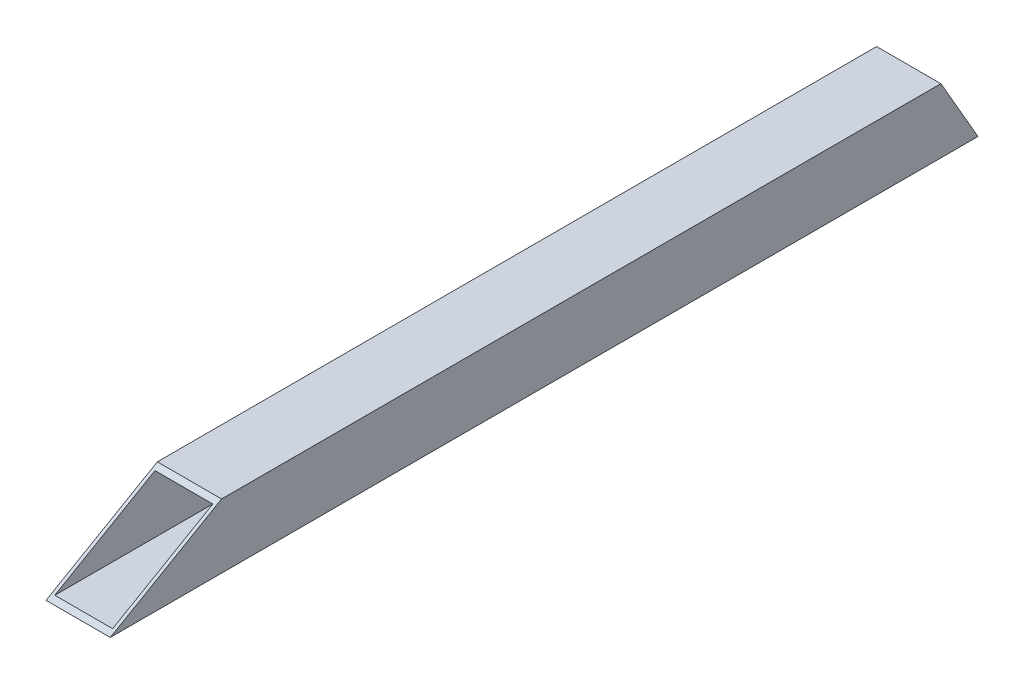
ISO-10303-21;
HEADER;
FILE_DESCRIPTION(('STEP AP214'),'2;1');
FILE_NAME('part.step','',(''),(''),'','','');
FILE_SCHEMA(('AUTOMOTIVE_DESIGN { 1 0 10303 214 1 1 1 1 }'));
ENDSEC;
DATA;
#1=APPLICATION_CONTEXT('core data for automotive mechanical design processes');
#2=APPLICATION_PROTOCOL_DEFINITION('international standard','automotive_design',2000,#1);
#3=PRODUCT_CONTEXT('',#1,'mechanical');
#4=PRODUCT('Part','Part','',(#3));
#5=PRODUCT_RELATED_PRODUCT_CATEGORY('part','',(#4));
#6=PRODUCT_DEFINITION_FORMATION('','',#4);
#7=PRODUCT_DEFINITION_CONTEXT('part definition',#1,'design');
#8=PRODUCT_DEFINITION('design','',#6,#7);
#9=PRODUCT_DEFINITION_SHAPE('','',#8);
#10=(LENGTH_UNIT() NAMED_UNIT(*) SI_UNIT(.MILLI.,.METRE.));
#11=(NAMED_UNIT(*) PLANE_ANGLE_UNIT() SI_UNIT($,.RADIAN.));
#12=(NAMED_UNIT(*) SI_UNIT($,.STERADIAN.) SOLID_ANGLE_UNIT());
#13=UNCERTAINTY_MEASURE_WITH_UNIT(LENGTH_MEASURE(1.E-05),#10,'distance_accuracy_value','');
#14=(GEOMETRIC_REPRESENTATION_CONTEXT(3) GLOBAL_UNCERTAINTY_ASSIGNED_CONTEXT((#13)) GLOBAL_UNIT_ASSIGNED_CONTEXT((#10,
#11,#12)) REPRESENTATION_CONTEXT('',''));
#15=CARTESIAN_POINT('',(0.,0.,0.));
#16=DIRECTION('',(0.,0.,1.));
#17=DIRECTION('',(1.,0.,0.));
#18=AXIS2_PLACEMENT_3D('',#15,#16,#17);
#19=CARTESIAN_POINT('',(1.,19.,270.));
#20=DIRECTION('',(0.,-1.,0.));
#21=DIRECTION('',(0.,0.,-1.));
#22=AXIS2_PLACEMENT_3D('',#19,#20,#21);
#23=PLANE('',#22);
#24=DIRECTION('',(1.,0.,0.));
#25=VECTOR('',#24,1.);
#26=CARTESIAN_POINT('',(1.,19.,237.091034656192));
#27=LINE('',#26,#25);
#28=CARTESIAN_POINT('',(1.,19.,237.091034656192));
#29=VERTEX_POINT('',#28);
#30=CARTESIAN_POINT('',(19.,19.,237.091034656192));
#31=VERTEX_POINT('',#30);
#32=EDGE_CURVE('E11',#29,#31,#27,.T.);
#33=ORIENTED_EDGE('',*,*,#32,.F.);
#34=DIRECTION('',(0.,0.,-1.));
#35=VECTOR('',#34,1.);
#36=CARTESIAN_POINT('',(1.,19.,270.));
#37=LINE('',#36,#35);
#38=CARTESIAN_POINT('',(1.,19.,10.969655114603));
#39=VERTEX_POINT('',#38);
#40=EDGE_CURVE('E143',#29,#39,#37,.T.);
#41=ORIENTED_EDGE('',*,*,#40,.T.);
#42=DIRECTION('',(-1.,0.,0.));
#43=VECTOR('',#42,1.);
#44=CARTESIAN_POINT('',(1.,19.,10.969655114603));
#45=LINE('',#44,#43);
#46=CARTESIAN_POINT('',(19.,19.,10.969655114603));
#47=VERTEX_POINT('',#46);
#48=EDGE_CURVE('E43',#47,#39,#45,.T.);
#49=ORIENTED_EDGE('',*,*,#48,.F.);
#50=DIRECTION('',(0.,0.,-1.));
#51=VECTOR('',#50,1.);
#52=CARTESIAN_POINT('',(19.,19.,270.));
#53=LINE('',#52,#51);
#54=EDGE_CURVE('E149',#31,#47,#53,.T.);
#55=ORIENTED_EDGE('',*,*,#54,.F.);
#56=EDGE_LOOP('',(#33,#41,#49,#55));
#57=FACE_BOUND('',#56,.T.);
#58=ADVANCED_FACE('F35',(#57),#23,.T.);
#59=CARTESIAN_POINT('',(19.,1.,270.));
#60=DIRECTION('',(-1.,0.,0.));
#61=DIRECTION('',(0.,0.,1.));
#62=AXIS2_PLACEMENT_3D('',#59,#60,#61);
#63=PLANE('',#62);
#64=DIRECTION('',(0.,-0.500000000000004,0.866025403784436));
#65=VECTOR('',#64,1.);
#66=CARTESIAN_POINT('',(19.,0.250000000000004,269.566987298108));
#67=LINE('',#66,#65);
#68=CARTESIAN_POINT('',(19.,1.,268.267949192431));
#69=VERTEX_POINT('',#68);
#70=EDGE_CURVE('E173',#31,#69,#67,.T.);
#71=ORIENTED_EDGE('',*,*,#70,.F.);
#72=ORIENTED_EDGE('',*,*,#54,.T.);
#73=DIRECTION('',(0.,0.866025403784436,0.500000000000005));
#74=VECTOR('',#73,1.);
#75=CARTESIAN_POINT('',(19.,117.6634295109,67.9330127018935));
#76=LINE('',#75,#74);
#77=CARTESIAN_POINT('',(19.,1.,0.577350269189633));
#78=VERTEX_POINT('',#77);
#79=EDGE_CURVE('E133',#78,#47,#76,.T.);
#80=ORIENTED_EDGE('',*,*,#79,.F.);
#81=DIRECTION('',(0.,0.,-1.));
#82=VECTOR('',#81,1.);
#83=CARTESIAN_POINT('',(19.,1.,270.));
#84=LINE('',#83,#82);
#85=EDGE_CURVE('E151',#69,#78,#84,.T.);
#86=ORIENTED_EDGE('',*,*,#85,.F.);
#87=EDGE_LOOP('',(#71,#72,#80,#86));
#88=FACE_BOUND('',#87,.T.);
#89=ADVANCED_FACE('F183',(#88),#63,.T.);
#90=CARTESIAN_POINT('',(1.,1.,270.));
#91=DIRECTION('',(0.,1.,0.));
#92=DIRECTION('',(0.,0.,1.));
#93=AXIS2_PLACEMENT_3D('',#90,#91,#92);
#94=PLANE('',#93);
#95=DIRECTION('',(-1.,0.,0.));
#96=VECTOR('',#95,1.);
#97=CARTESIAN_POINT('',(1.,1.,268.267949192431));
#98=LINE('',#97,#96);
#99=CARTESIAN_POINT('',(1.,1.,268.267949192431));
#100=VERTEX_POINT('',#99);
#101=EDGE_CURVE('E175',#69,#100,#98,.T.);
#102=ORIENTED_EDGE('',*,*,#101,.F.);
#103=ORIENTED_EDGE('',*,*,#85,.T.);
#104=DIRECTION('',(1.,0.,0.));
#105=VECTOR('',#104,1.);
#106=CARTESIAN_POINT('',(1.,1.,0.577350269189592));
#107=LINE('',#106,#105);
#108=CARTESIAN_POINT('',(1.,1.,0.577350269189592));
#109=VERTEX_POINT('',#108);
#110=EDGE_CURVE('E146',#109,#78,#107,.T.);
#111=ORIENTED_EDGE('',*,*,#110,.F.);
#112=DIRECTION('',(0.,0.,-1.));
#113=VECTOR('',#112,1.);
#114=CARTESIAN_POINT('',(1.,1.,270.));
#115=LINE('',#114,#113);
#116=EDGE_CURVE('E145',#100,#109,#115,.T.);
#117=ORIENTED_EDGE('',*,*,#116,.F.);
#118=EDGE_LOOP('',(#102,#103,#111,#117));
#119=FACE_BOUND('',#118,.T.);
#120=ADVANCED_FACE('F180',(#119),#94,.T.);
#121=CARTESIAN_POINT('',(1.,1.,270.));
#122=DIRECTION('',(1.,0.,0.));
#123=DIRECTION('',(0.,0.,-1.));
#124=AXIS2_PLACEMENT_3D('',#121,#122,#123);
#125=PLANE('',#124);
#126=DIRECTION('',(0.,0.500000000000004,-0.866025403784436));
#127=VECTOR('',#126,1.);
#128=CARTESIAN_POINT('',(1.,0.250000000000004,269.566987298108));
#129=LINE('',#128,#127);
#130=EDGE_CURVE('E153',#100,#29,#129,.T.);
#131=ORIENTED_EDGE('',*,*,#130,.F.);
#132=ORIENTED_EDGE('',*,*,#116,.T.);
#133=DIRECTION('',(0.,-0.866025403784436,-0.500000000000005));
#134=VECTOR('',#133,1.);
#135=CARTESIAN_POINT('',(1.,117.6634295109,67.9330127018935));
#136=LINE('',#135,#134);
#137=EDGE_CURVE('E130',#39,#109,#136,.T.);
#138=ORIENTED_EDGE('',*,*,#137,.F.);
#139=ORIENTED_EDGE('',*,*,#40,.F.);
#140=EDGE_LOOP('',(#131,#132,#138,#139));
#141=FACE_BOUND('',#140,.T.);
#142=ADVANCED_FACE('F142',(#141),#125,.T.);
#143=CARTESIAN_POINT('',(-230.,0.,0.));
#144=DIRECTION('',(0.,-0.500000000000005,0.866025403784436));
#145=DIRECTION('',(0.,-0.866025403784436,-0.500000000000005));
#146=AXIS2_PLACEMENT_3D('',#143,#144,#145);
#147=PLANE('',#146);
#148=ORIENTED_EDGE('',*,*,#137,.T.);
#149=ORIENTED_EDGE('',*,*,#110,.T.);
#150=ORIENTED_EDGE('',*,*,#79,.T.);
#151=ORIENTED_EDGE('',*,*,#48,.T.);
#152=EDGE_LOOP('',(#148,#149,#150,#151));
#153=FACE_BOUND('',#152,.T.);
#154=DIRECTION('',(1.,0.,0.));
#155=VECTOR('',#154,1.);
#156=CARTESIAN_POINT('',(-230.,20.,11.5470053837927));
#157=LINE('',#156,#155);
#158=CARTESIAN_POINT('',(0.,20.,11.5470053837927));
#159=VERTEX_POINT('',#158);
#160=CARTESIAN_POINT('',(20.,20.,11.5470053837927));
#161=VERTEX_POINT('',#160);
#162=EDGE_CURVE('E117',#159,#161,#157,.T.);
#163=ORIENTED_EDGE('',*,*,#162,.T.);
#164=DIRECTION('',(0.,-0.866025403784436,-0.500000000000005));
#165=VECTOR('',#164,1.);
#166=CARTESIAN_POINT('',(20.,0.,0.));
#167=LINE('',#166,#165);
#168=CARTESIAN_POINT('',(20.,0.,0.));
#169=VERTEX_POINT('',#168);
#170=EDGE_CURVE('E165',#161,#169,#167,.T.);
#171=ORIENTED_EDGE('',*,*,#170,.T.);
#172=DIRECTION('',(1.,0.,0.));
#173=VECTOR('',#172,1.);
#174=CARTESIAN_POINT('',(0.,0.,0.));
#175=LINE('',#174,#173);
#176=CARTESIAN_POINT('',(0.,0.,0.));
#177=VERTEX_POINT('',#176);
#178=EDGE_CURVE('E106',#177,#169,#175,.T.);
#179=ORIENTED_EDGE('',*,*,#178,.F.);
#180=DIRECTION('',(0.,-0.866025403784436,-0.500000000000005));
#181=VECTOR('',#180,1.);
#182=CARTESIAN_POINT('',(0.,116.9134295109,67.5000000000013));
#183=LINE('',#182,#181);
#184=EDGE_CURVE('E58',#159,#177,#183,.T.);
#185=ORIENTED_EDGE('',*,*,#184,.F.);
#186=EDGE_LOOP('',(#163,#171,#179,#185));
#187=FACE_BOUND('',#186,.T.);
#188=ADVANCED_FACE('F129',(#153,#187),#147,.F.);
#189=CARTESIAN_POINT('',(-230.,0.,270.));
#190=DIRECTION('',(0.,-0.866025403784436,-0.500000000000004));
#191=DIRECTION('',(0.,0.500000000000004,-0.866025403784436));
#192=AXIS2_PLACEMENT_3D('',#189,#190,#191);
#193=PLANE('',#192);
#194=ORIENTED_EDGE('',*,*,#130,.T.);
#195=ORIENTED_EDGE('',*,*,#32,.T.);
#196=ORIENTED_EDGE('',*,*,#70,.T.);
#197=ORIENTED_EDGE('',*,*,#101,.T.);
#198=EDGE_LOOP('',(#194,#195,#196,#197));
#199=FACE_BOUND('',#198,.T.);
#200=DIRECTION('',(1.,0.,0.));
#201=VECTOR('',#200,1.);
#202=CARTESIAN_POINT('',(0.,0.,270.));
#203=LINE('',#202,#201);
#204=CARTESIAN_POINT('',(0.,0.,270.));
#205=VERTEX_POINT('',#204);
#206=CARTESIAN_POINT('',(20.,0.,270.));
#207=VERTEX_POINT('',#206);
#208=EDGE_CURVE('E97',#205,#207,#203,.T.);
#209=ORIENTED_EDGE('',*,*,#208,.T.);
#210=DIRECTION('',(0.,0.500000000000004,-0.866025403784436));
#211=VECTOR('',#210,1.);
#212=CARTESIAN_POINT('',(20.,0.,270.));
#213=LINE('',#212,#211);
#214=CARTESIAN_POINT('',(20.,20.,235.358983848623));
#215=VERTEX_POINT('',#214);
#216=EDGE_CURVE('E50',#207,#215,#213,.T.);
#217=ORIENTED_EDGE('',*,*,#216,.T.);
#218=DIRECTION('',(1.,0.,0.));
#219=VECTOR('',#218,1.);
#220=CARTESIAN_POINT('',(-230.,20.,235.358983848623));
#221=LINE('',#220,#219);
#222=CARTESIAN_POINT('',(0.,20.,235.358983848623));
#223=VERTEX_POINT('',#222);
#224=EDGE_CURVE('E116',#223,#215,#221,.T.);
#225=ORIENTED_EDGE('',*,*,#224,.F.);
#226=DIRECTION('',(0.,0.500000000000004,-0.866025403784436));
#227=VECTOR('',#226,1.);
#228=CARTESIAN_POINT('',(0.,0.,270.));
#229=LINE('',#228,#227);
#230=EDGE_CURVE('E100',#205,#223,#229,.T.);
#231=ORIENTED_EDGE('',*,*,#230,.F.);
#232=EDGE_LOOP('',(#209,#217,#225,#231));
#233=FACE_BOUND('',#232,.T.);
#234=ADVANCED_FACE('F98',(#199,#233),#193,.F.);
#235=CARTESIAN_POINT('',(0.,0.,270.));
#236=DIRECTION('',(1.,0.,0.));
#237=DIRECTION('',(0.,0.,-1.));
#238=AXIS2_PLACEMENT_3D('',#235,#236,#237);
#239=PLANE('',#238);
#240=DIRECTION('',(0.,0.,-1.));
#241=VECTOR('',#240,1.);
#242=CARTESIAN_POINT('',(0.,0.,270.));
#243=LINE('',#242,#241);
#244=EDGE_CURVE('E121',#205,#177,#243,.T.);
#245=ORIENTED_EDGE('',*,*,#244,.F.);
#246=ORIENTED_EDGE('',*,*,#230,.T.);
#247=DIRECTION('',(0.,0.,-1.));
#248=VECTOR('',#247,1.);
#249=CARTESIAN_POINT('',(0.,20.,270.));
#250=LINE('',#249,#248);
#251=EDGE_CURVE('E105',#223,#159,#250,.T.);
#252=ORIENTED_EDGE('',*,*,#251,.T.);
#253=ORIENTED_EDGE('',*,*,#184,.T.);
#254=EDGE_LOOP('',(#245,#246,#252,#253));
#255=FACE_BOUND('',#254,.T.);
#256=ADVANCED_FACE('F37',(#255),#239,.F.);
#257=CARTESIAN_POINT('',(0.,0.,270.));
#258=DIRECTION('',(0.,1.,0.));
#259=DIRECTION('',(0.,0.,1.));
#260=AXIS2_PLACEMENT_3D('',#257,#258,#259);
#261=PLANE('',#260);
#262=ORIENTED_EDGE('',*,*,#178,.T.);
#263=DIRECTION('',(0.,0.,-1.));
#264=VECTOR('',#263,1.);
#265=CARTESIAN_POINT('',(20.,0.,270.));
#266=LINE('',#265,#264);
#267=EDGE_CURVE('E113',#207,#169,#266,.T.);
#268=ORIENTED_EDGE('',*,*,#267,.F.);
#269=ORIENTED_EDGE('',*,*,#208,.F.);
#270=ORIENTED_EDGE('',*,*,#244,.T.);
#271=EDGE_LOOP('',(#262,#268,#269,#270));
#272=FACE_BOUND('',#271,.T.);
#273=ADVANCED_FACE('F120',(#272),#261,.F.);
#274=CARTESIAN_POINT('',(20.,0.,270.));
#275=DIRECTION('',(-1.,0.,0.));
#276=DIRECTION('',(0.,0.,1.));
#277=AXIS2_PLACEMENT_3D('',#274,#275,#276);
#278=PLANE('',#277);
#279=DIRECTION('',(0.,0.,-1.));
#280=VECTOR('',#279,1.);
#281=CARTESIAN_POINT('',(20.,20.,270.));
#282=LINE('',#281,#280);
#283=EDGE_CURVE('E115',#215,#161,#282,.T.);
#284=ORIENTED_EDGE('',*,*,#283,.F.);
#285=ORIENTED_EDGE('',*,*,#216,.F.);
#286=ORIENTED_EDGE('',*,*,#267,.T.);
#287=ORIENTED_EDGE('',*,*,#170,.F.);
#288=EDGE_LOOP('',(#284,#285,#286,#287));
#289=FACE_BOUND('',#288,.T.);
#290=ADVANCED_FACE('F111',(#289),#278,.F.);
#291=CARTESIAN_POINT('',(0.,20.,270.));
#292=DIRECTION('',(0.,-1.,0.));
#293=DIRECTION('',(0.,0.,-1.));
#294=AXIS2_PLACEMENT_3D('',#291,#292,#293);
#295=PLANE('',#294);
#296=ORIENTED_EDGE('',*,*,#251,.F.);
#297=ORIENTED_EDGE('',*,*,#224,.T.);
#298=ORIENTED_EDGE('',*,*,#283,.T.);
#299=ORIENTED_EDGE('',*,*,#162,.F.);
#300=EDGE_LOOP('',(#296,#297,#298,#299));
#301=FACE_BOUND('',#300,.T.);
#302=ADVANCED_FACE('F164',(#301),#295,.F.);
#303=CLOSED_SHELL('',(#58,#89,#120,#142,#188,#234,#256,#273,#290,#302));
#304=MANIFOLD_SOLID_BREP('B2',#303);
#305=ADVANCED_BREP_SHAPE_REPRESENTATION('',(#18,#304),#14);
#306=SHAPE_DEFINITION_REPRESENTATION(#9,#305);
ENDSEC;
END-ISO-10303-21;
